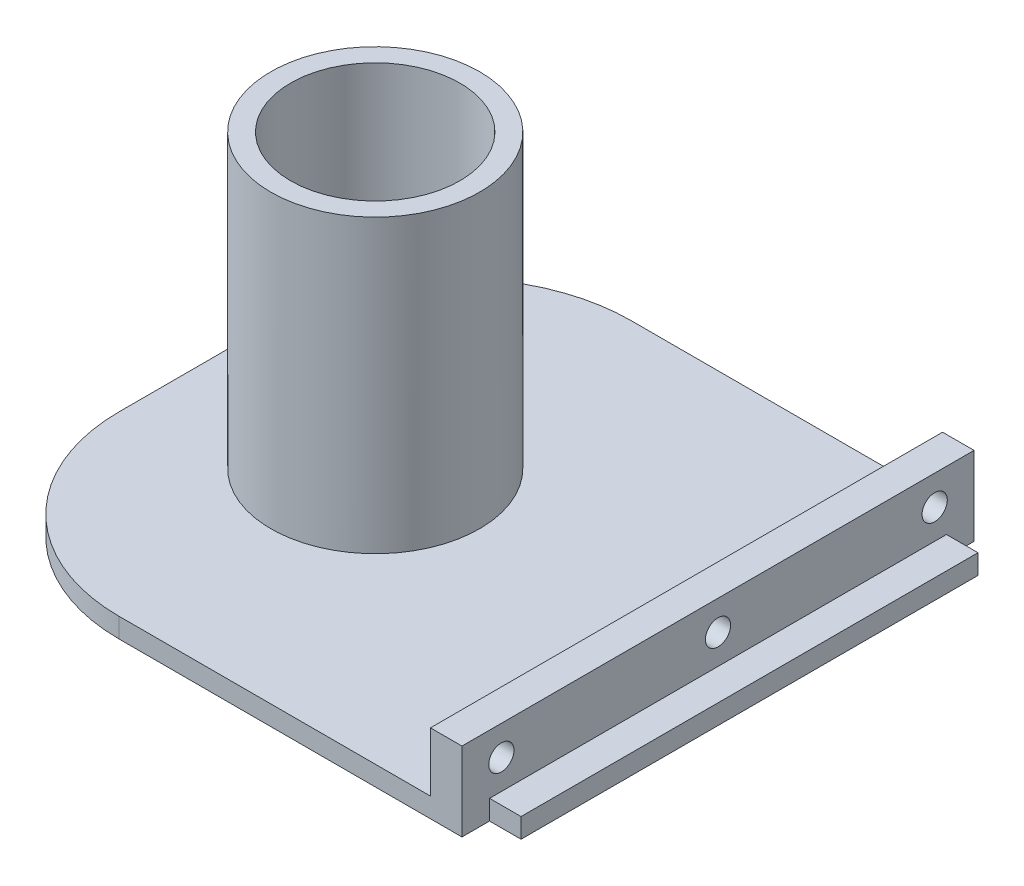
ISO-10303-21;
HEADER;
FILE_DESCRIPTION(('STEP AP214'),'2;1');
FILE_NAME('part.step','',(''),(''),'','','');
FILE_SCHEMA(('AUTOMOTIVE_DESIGN { 1 0 10303 214 1 1 1 1 }'));
ENDSEC;
DATA;
#1=APPLICATION_CONTEXT('core data for automotive mechanical design processes');
#2=APPLICATION_PROTOCOL_DEFINITION('international standard','automotive_design',2000,#1);
#3=PRODUCT_CONTEXT('',#1,'mechanical');
#4=PRODUCT('Part','Part','',(#3));
#5=PRODUCT_RELATED_PRODUCT_CATEGORY('part','',(#4));
#6=PRODUCT_DEFINITION_FORMATION('','',#4);
#7=PRODUCT_DEFINITION_CONTEXT('part definition',#1,'design');
#8=PRODUCT_DEFINITION('design','',#6,#7);
#9=PRODUCT_DEFINITION_SHAPE('','',#8);
#10=(LENGTH_UNIT() NAMED_UNIT(*) SI_UNIT(.MILLI.,.METRE.));
#11=(NAMED_UNIT(*) PLANE_ANGLE_UNIT() SI_UNIT($,.RADIAN.));
#12=(NAMED_UNIT(*) SI_UNIT($,.STERADIAN.) SOLID_ANGLE_UNIT());
#13=UNCERTAINTY_MEASURE_WITH_UNIT(LENGTH_MEASURE(1.E-05),#10,'distance_accuracy_value','');
#14=(GEOMETRIC_REPRESENTATION_CONTEXT(3) GLOBAL_UNCERTAINTY_ASSIGNED_CONTEXT((#13)) GLOBAL_UNIT_ASSIGNED_CONTEXT((#10,
#11,#12)) REPRESENTATION_CONTEXT('',''));
#15=CARTESIAN_POINT('',(0.,0.,0.));
#16=DIRECTION('',(0.,0.,1.));
#17=DIRECTION('',(1.,0.,0.));
#18=AXIS2_PLACEMENT_3D('',#15,#16,#17);
#19=CARTESIAN_POINT('',(-12.51,1.25,10.01));
#20=DIRECTION('',(0.,-1.,0.));
#21=DIRECTION('',(0.,0.,-1.));
#22=AXIS2_PLACEMENT_3D('',#19,#20,#21);
#23=PLANE('',#22);
#24=CARTESIAN_POINT('',(-12.51,1.25,0.));
#25=DIRECTION('',(0.,-1.,0.));
#26=DIRECTION('',(0.,0.,-1.));
#27=AXIS2_PLACEMENT_3D('',#24,#25,#26);
#28=CIRCLE('',#27,13.25);
#29=CARTESIAN_POINT('',(-12.51,1.25,-13.25));
#30=VERTEX_POINT('',#29);
#31=EDGE_CURVE('E223',#30,#30,#28,.F.);
#32=ORIENTED_EDGE('',*,*,#31,.F.);
#33=EDGE_LOOP('',(#32));
#34=FACE_BOUND('',#33,.T.);
#35=DIRECTION('',(0.,0.,1.));
#36=VECTOR('',#35,1.);
#37=CARTESIAN_POINT('',(27.,1.25,32.5));
#38=LINE('',#37,#36);
#39=CARTESIAN_POINT('',(27.,1.25,-32.5));
#40=VERTEX_POINT('',#39);
#41=CARTESIAN_POINT('',(27.,1.25,32.5));
#42=VERTEX_POINT('',#41);
#43=EDGE_CURVE('E50',#40,#42,#38,.T.);
#44=ORIENTED_EDGE('',*,*,#43,.F.);
#45=DIRECTION('',(-1.,0.,0.));
#46=VECTOR('',#45,1.);
#47=CARTESIAN_POINT('',(-12.51,1.25,-32.5));
#48=LINE('',#47,#46);
#49=CARTESIAN_POINT('',(-12.51,1.25,-32.5));
#50=VERTEX_POINT('',#49);
#51=EDGE_CURVE('E145',#40,#50,#48,.T.);
#52=ORIENTED_EDGE('',*,*,#51,.T.);
#53=CARTESIAN_POINT('',(-12.51,1.25,-10.01));
#54=DIRECTION('',(0.,1.,0.));
#55=DIRECTION('',(0.,0.,-1.));
#56=AXIS2_PLACEMENT_3D('',#53,#54,#55);
#57=CIRCLE('',#56,22.49);
#58=CARTESIAN_POINT('',(-35.,1.25,-10.01));
#59=VERTEX_POINT('',#58);
#60=EDGE_CURVE('E171',#50,#59,#57,.T.);
#61=ORIENTED_EDGE('',*,*,#60,.T.);
#62=DIRECTION('',(0.,0.,1.));
#63=VECTOR('',#62,1.);
#64=CARTESIAN_POINT('',(-35.,1.25,-10.01));
#65=LINE('',#64,#63);
#66=CARTESIAN_POINT('',(-35.,1.25,10.01));
#67=VERTEX_POINT('',#66);
#68=EDGE_CURVE('E173',#59,#67,#65,.T.);
#69=ORIENTED_EDGE('',*,*,#68,.T.);
#70=CARTESIAN_POINT('',(-12.51,1.25,10.01));
#71=DIRECTION('',(0.,1.,0.));
#72=DIRECTION('',(0.,0.,-1.));
#73=AXIS2_PLACEMENT_3D('',#70,#71,#72);
#74=CIRCLE('',#73,22.49);
#75=CARTESIAN_POINT('',(-12.51,1.25,32.5));
#76=VERTEX_POINT('',#75);
#77=EDGE_CURVE('E160',#67,#76,#74,.T.);
#78=ORIENTED_EDGE('',*,*,#77,.T.);
#79=DIRECTION('',(1.,0.,0.));
#80=VECTOR('',#79,1.);
#81=CARTESIAN_POINT('',(-12.51,1.25,32.5));
#82=LINE('',#81,#80);
#83=EDGE_CURVE('E55',#76,#42,#82,.T.);
#84=ORIENTED_EDGE('',*,*,#83,.T.);
#85=EDGE_LOOP('',(#44,#52,#61,#69,#78,#84));
#86=FACE_BOUND('',#85,.T.);
#87=ADVANCED_FACE('F34',(#34,#86),#23,.F.);
#88=DIRECTION('',(0.,0.,-1.));
#89=VECTOR('',#88,1.);
#90=CARTESIAN_POINT('',(31.,1.25,10.01));
#91=LINE('',#90,#89);
#92=CARTESIAN_POINT('',(31.,1.25,29.));
#93=VERTEX_POINT('',#92);
#94=CARTESIAN_POINT('',(31.,1.25,-29.));
#95=VERTEX_POINT('',#94);
#96=EDGE_CURVE('E226',#93,#95,#91,.T.);
#97=ORIENTED_EDGE('',*,*,#96,.F.);
#98=DIRECTION('',(1.,0.,0.));
#99=VECTOR('',#98,1.);
#100=CARTESIAN_POINT('',(31.,1.25,29.));
#101=LINE('',#100,#99);
#102=CARTESIAN_POINT('',(35.,1.25,29.));
#103=VERTEX_POINT('',#102);
#104=EDGE_CURVE('E164',#93,#103,#101,.T.);
#105=ORIENTED_EDGE('',*,*,#104,.T.);
#106=DIRECTION('',(0.,0.,-1.));
#107=VECTOR('',#106,1.);
#108=CARTESIAN_POINT('',(35.,1.25,-29.));
#109=LINE('',#108,#107);
#110=CARTESIAN_POINT('',(35.,1.25,-29.));
#111=VERTEX_POINT('',#110);
#112=EDGE_CURVE('E166',#103,#111,#109,.T.);
#113=ORIENTED_EDGE('',*,*,#112,.T.);
#114=DIRECTION('',(-1.,0.,0.));
#115=VECTOR('',#114,1.);
#116=CARTESIAN_POINT('',(31.,1.25,-29.));
#117=LINE('',#116,#115);
#118=EDGE_CURVE('E168',#111,#95,#117,.T.);
#119=ORIENTED_EDGE('',*,*,#118,.T.);
#120=EDGE_LOOP('',(#97,#105,#113,#119));
#121=FACE_BOUND('',#120,.T.);
#122=ADVANCED_FACE('F261',(#121),#23,.F.);
#123=CARTESIAN_POINT('',(-12.51,1.25,10.01));
#124=DIRECTION('',(0.,-1.,0.));
#125=DIRECTION('',(0.,0.,-1.));
#126=AXIS2_PLACEMENT_3D('',#123,#124,#125);
#127=CYLINDRICAL_SURFACE('',#126,22.49);
#128=CARTESIAN_POINT('',(-12.51,-1.25,10.01));
#129=DIRECTION('',(0.,1.,0.));
#130=DIRECTION('',(0.,0.,-1.));
#131=AXIS2_PLACEMENT_3D('',#128,#129,#130);
#132=CIRCLE('',#131,22.49);
#133=CARTESIAN_POINT('',(-35.,-1.25,10.01));
#134=VERTEX_POINT('',#133);
#135=CARTESIAN_POINT('',(-12.51,-1.25,32.5));
#136=VERTEX_POINT('',#135);
#137=EDGE_CURVE('E159',#134,#136,#132,.T.);
#138=ORIENTED_EDGE('',*,*,#137,.T.);
#139=DIRECTION('',(0.,-1.,0.));
#140=VECTOR('',#139,1.);
#141=CARTESIAN_POINT('',(-12.51,1.25,32.5));
#142=LINE('',#141,#140);
#143=EDGE_CURVE('E220',#76,#136,#142,.T.);
#144=ORIENTED_EDGE('',*,*,#143,.F.);
#145=ORIENTED_EDGE('',*,*,#77,.F.);
#146=DIRECTION('',(0.,-1.,0.));
#147=VECTOR('',#146,1.);
#148=CARTESIAN_POINT('',(-35.,1.25,10.01));
#149=LINE('',#148,#147);
#150=EDGE_CURVE('E175',#67,#134,#149,.T.);
#151=ORIENTED_EDGE('',*,*,#150,.T.);
#152=EDGE_LOOP('',(#138,#144,#145,#151));
#153=FACE_BOUND('',#152,.T.);
#154=ADVANCED_FACE('F268',(#153),#127,.T.);
#155=CARTESIAN_POINT('',(-12.51,1.25,32.5));
#156=DIRECTION('',(0.,0.,-1.));
#157=DIRECTION('',(-1.,0.,0.));
#158=AXIS2_PLACEMENT_3D('',#155,#156,#157);
#159=PLANE('',#158);
#160=DIRECTION('',(1.,0.,0.));
#161=VECTOR('',#160,1.);
#162=CARTESIAN_POINT('',(-12.51,-1.25,32.5));
#163=LINE('',#162,#161);
#164=CARTESIAN_POINT('',(31.,-1.25,32.5));
#165=VERTEX_POINT('',#164);
#166=EDGE_CURVE('E178',#136,#165,#163,.T.);
#167=ORIENTED_EDGE('',*,*,#166,.T.);
#168=DIRECTION('',(0.,-1.,0.));
#169=VECTOR('',#168,1.);
#170=CARTESIAN_POINT('',(31.,1.25,32.5));
#171=LINE('',#170,#169);
#172=CARTESIAN_POINT('',(31.,8.75,32.5));
#173=VERTEX_POINT('',#172);
#174=EDGE_CURVE('E217',#173,#165,#171,.T.);
#175=ORIENTED_EDGE('',*,*,#174,.F.);
#176=DIRECTION('',(1.,0.,0.));
#177=VECTOR('',#176,1.);
#178=CARTESIAN_POINT('',(31.,8.75,32.5));
#179=LINE('',#178,#177);
#180=CARTESIAN_POINT('',(27.,8.75,32.5));
#181=VERTEX_POINT('',#180);
#182=EDGE_CURVE('E132',#181,#173,#179,.T.);
#183=ORIENTED_EDGE('',*,*,#182,.F.);
#184=DIRECTION('',(0.,-1.,0.));
#185=VECTOR('',#184,1.);
#186=CARTESIAN_POINT('',(27.,8.75,32.5));
#187=LINE('',#186,#185);
#188=EDGE_CURVE('E128',#181,#42,#187,.T.);
#189=ORIENTED_EDGE('',*,*,#188,.T.);
#190=ORIENTED_EDGE('',*,*,#83,.F.);
#191=ORIENTED_EDGE('',*,*,#143,.T.);
#192=EDGE_LOOP('',(#167,#175,#183,#189,#190,#191));
#193=FACE_BOUND('',#192,.T.);
#194=ADVANCED_FACE('F334',(#193),#159,.F.);
#195=CARTESIAN_POINT('',(31.,1.25,29.));
#196=DIRECTION('',(0.,0.,-1.));
#197=DIRECTION('',(-1.,0.,0.));
#198=AXIS2_PLACEMENT_3D('',#195,#196,#197);
#199=PLANE('',#198);
#200=DIRECTION('',(1.,0.,0.));
#201=VECTOR('',#200,1.);
#202=CARTESIAN_POINT('',(31.,-1.25,29.));
#203=LINE('',#202,#201);
#204=CARTESIAN_POINT('',(31.,-1.25,29.));
#205=VERTEX_POINT('',#204);
#206=CARTESIAN_POINT('',(35.,-1.25,29.));
#207=VERTEX_POINT('',#206);
#208=EDGE_CURVE('E182',#205,#207,#203,.T.);
#209=ORIENTED_EDGE('',*,*,#208,.T.);
#210=DIRECTION('',(0.,-1.,0.));
#211=VECTOR('',#210,1.);
#212=CARTESIAN_POINT('',(35.,1.25,29.));
#213=LINE('',#212,#211);
#214=EDGE_CURVE('E211',#103,#207,#213,.T.);
#215=ORIENTED_EDGE('',*,*,#214,.F.);
#216=ORIENTED_EDGE('',*,*,#104,.F.);
#217=DIRECTION('',(0.,-1.,0.));
#218=VECTOR('',#217,1.);
#219=CARTESIAN_POINT('',(31.,1.25,29.));
#220=LINE('',#219,#218);
#221=EDGE_CURVE('E214',#93,#205,#220,.T.);
#222=ORIENTED_EDGE('',*,*,#221,.T.);
#223=EDGE_LOOP('',(#209,#215,#216,#222));
#224=FACE_BOUND('',#223,.T.);
#225=ADVANCED_FACE('F330',(#224),#199,.F.);
#226=CARTESIAN_POINT('',(35.,1.25,-29.));
#227=DIRECTION('',(-1.,0.,0.));
#228=DIRECTION('',(0.,0.,1.));
#229=AXIS2_PLACEMENT_3D('',#226,#227,#228);
#230=PLANE('',#229);
#231=DIRECTION('',(0.,0.,-1.));
#232=VECTOR('',#231,1.);
#233=CARTESIAN_POINT('',(35.,-1.25,-29.));
#234=LINE('',#233,#232);
#235=CARTESIAN_POINT('',(35.,-1.25,-29.));
#236=VERTEX_POINT('',#235);
#237=EDGE_CURVE('E184',#207,#236,#234,.T.);
#238=ORIENTED_EDGE('',*,*,#237,.T.);
#239=DIRECTION('',(0.,-1.,0.));
#240=VECTOR('',#239,1.);
#241=CARTESIAN_POINT('',(35.,1.25,-29.));
#242=LINE('',#241,#240);
#243=EDGE_CURVE('E208',#111,#236,#242,.T.);
#244=ORIENTED_EDGE('',*,*,#243,.F.);
#245=ORIENTED_EDGE('',*,*,#112,.F.);
#246=ORIENTED_EDGE('',*,*,#214,.T.);
#247=EDGE_LOOP('',(#238,#244,#245,#246));
#248=FACE_BOUND('',#247,.T.);
#249=ADVANCED_FACE('F326',(#248),#230,.F.);
#250=CARTESIAN_POINT('',(31.,1.25,-29.));
#251=DIRECTION('',(0.,0.,1.));
#252=DIRECTION('',(1.,0.,0.));
#253=AXIS2_PLACEMENT_3D('',#250,#251,#252);
#254=PLANE('',#253);
#255=DIRECTION('',(-1.,0.,0.));
#256=VECTOR('',#255,1.);
#257=CARTESIAN_POINT('',(31.,-1.25,-29.));
#258=LINE('',#257,#256);
#259=CARTESIAN_POINT('',(31.,-1.25,-29.));
#260=VERTEX_POINT('',#259);
#261=EDGE_CURVE('E186',#236,#260,#258,.T.);
#262=ORIENTED_EDGE('',*,*,#261,.T.);
#263=DIRECTION('',(0.,-1.,0.));
#264=VECTOR('',#263,1.);
#265=CARTESIAN_POINT('',(31.,1.25,-29.));
#266=LINE('',#265,#264);
#267=EDGE_CURVE('E205',#95,#260,#266,.T.);
#268=ORIENTED_EDGE('',*,*,#267,.F.);
#269=ORIENTED_EDGE('',*,*,#118,.F.);
#270=ORIENTED_EDGE('',*,*,#243,.T.);
#271=EDGE_LOOP('',(#262,#268,#269,#270));
#272=FACE_BOUND('',#271,.T.);
#273=ADVANCED_FACE('F322',(#272),#254,.F.);
#274=CARTESIAN_POINT('',(31.,1.25,-32.5));
#275=DIRECTION('',(-1.,0.,0.));
#276=DIRECTION('',(0.,0.,1.));
#277=AXIS2_PLACEMENT_3D('',#274,#275,#276);
#278=PLANE('',#277);
#279=CARTESIAN_POINT('',(31.,5.,-27.5));
#280=DIRECTION('',(-1.,0.,0.));
#281=DIRECTION('',(0.,0.,1.));
#282=AXIS2_PLACEMENT_3D('',#279,#280,#281);
#283=CIRCLE('',#282,1.6);
#284=CARTESIAN_POINT('',(31.,5.,-25.9));
#285=VERTEX_POINT('',#284);
#286=EDGE_CURVE('E374',#285,#285,#283,.T.);
#287=ORIENTED_EDGE('',*,*,#286,.T.);
#288=EDGE_LOOP('',(#287));
#289=FACE_BOUND('',#288,.T.);
#290=CARTESIAN_POINT('',(31.0000000000001,5.,0.));
#291=DIRECTION('',(-1.,0.,0.));
#292=DIRECTION('',(0.,0.,1.));
#293=AXIS2_PLACEMENT_3D('',#290,#291,#292);
#294=CIRCLE('',#293,1.6);
#295=CARTESIAN_POINT('',(31.0000000000001,5.,1.6));
#296=VERTEX_POINT('',#295);
#297=EDGE_CURVE('E376',#296,#296,#294,.T.);
#298=ORIENTED_EDGE('',*,*,#297,.T.);
#299=EDGE_LOOP('',(#298));
#300=FACE_BOUND('',#299,.T.);
#301=CARTESIAN_POINT('',(31.0000000000001,5.,27.5));
#302=DIRECTION('',(-1.,0.,0.));
#303=DIRECTION('',(0.,0.,1.));
#304=AXIS2_PLACEMENT_3D('',#301,#302,#303);
#305=CIRCLE('',#304,1.6);
#306=CARTESIAN_POINT('',(31.0000000000001,5.,29.1));
#307=VERTEX_POINT('',#306);
#308=EDGE_CURVE('E380',#307,#307,#305,.T.);
#309=ORIENTED_EDGE('',*,*,#308,.T.);
#310=EDGE_LOOP('',(#309));
#311=FACE_BOUND('',#310,.T.);
#312=DIRECTION('',(0.,0.,-1.));
#313=VECTOR('',#312,1.);
#314=CARTESIAN_POINT('',(31.,-1.25,-32.5));
#315=LINE('',#314,#313);
#316=CARTESIAN_POINT('',(31.,-1.25,-32.5));
#317=VERTEX_POINT('',#316);
#318=EDGE_CURVE('E188',#260,#317,#315,.T.);
#319=ORIENTED_EDGE('',*,*,#318,.T.);
#320=DIRECTION('',(0.,-1.,0.));
#321=VECTOR('',#320,1.);
#322=CARTESIAN_POINT('',(31.,1.25,-32.5));
#323=LINE('',#322,#321);
#324=CARTESIAN_POINT('',(31.,8.75,-32.5));
#325=VERTEX_POINT('',#324);
#326=EDGE_CURVE('E203',#325,#317,#323,.T.);
#327=ORIENTED_EDGE('',*,*,#326,.F.);
#328=DIRECTION('',(0.,0.,-1.));
#329=VECTOR('',#328,1.);
#330=CARTESIAN_POINT('',(31.,8.75,-32.5));
#331=LINE('',#330,#329);
#332=EDGE_CURVE('E139',#173,#325,#331,.T.);
#333=ORIENTED_EDGE('',*,*,#332,.F.);
#334=ORIENTED_EDGE('',*,*,#174,.T.);
#335=DIRECTION('',(0.,0.,-1.));
#336=VECTOR('',#335,1.);
#337=CARTESIAN_POINT('',(31.,-1.25,32.5));
#338=LINE('',#337,#336);
#339=EDGE_CURVE('E180',#165,#205,#338,.T.);
#340=ORIENTED_EDGE('',*,*,#339,.T.);
#341=ORIENTED_EDGE('',*,*,#221,.F.);
#342=ORIENTED_EDGE('',*,*,#96,.T.);
#343=ORIENTED_EDGE('',*,*,#267,.T.);
#344=EDGE_LOOP('',(#319,#327,#333,#334,#340,#341,#342,#343));
#345=FACE_BOUND('',#344,.T.);
#346=ADVANCED_FACE('F319',(#289,#300,#311,#345),#278,.F.);
#347=CARTESIAN_POINT('',(-12.51,1.25,-32.5));
#348=DIRECTION('',(0.,0.,1.));
#349=DIRECTION('',(1.,0.,0.));
#350=AXIS2_PLACEMENT_3D('',#347,#348,#349);
#351=PLANE('',#350);
#352=DIRECTION('',(-1.,0.,0.));
#353=VECTOR('',#352,1.);
#354=CARTESIAN_POINT('',(-12.51,-1.25,-32.5));
#355=LINE('',#354,#353);
#356=CARTESIAN_POINT('',(-12.51,-1.25,-32.5));
#357=VERTEX_POINT('',#356);
#358=EDGE_CURVE('E190',#317,#357,#355,.T.);
#359=ORIENTED_EDGE('',*,*,#358,.T.);
#360=DIRECTION('',(0.,-1.,0.));
#361=VECTOR('',#360,1.);
#362=CARTESIAN_POINT('',(-12.51,1.25,-32.5));
#363=LINE('',#362,#361);
#364=EDGE_CURVE('E200',#50,#357,#363,.T.);
#365=ORIENTED_EDGE('',*,*,#364,.F.);
#366=ORIENTED_EDGE('',*,*,#51,.F.);
#367=DIRECTION('',(0.,-1.,0.));
#368=VECTOR('',#367,1.);
#369=CARTESIAN_POINT('',(27.,8.75,-32.5));
#370=LINE('',#369,#368);
#371=CARTESIAN_POINT('',(27.,8.75,-32.5));
#372=VERTEX_POINT('',#371);
#373=EDGE_CURVE('E126',#372,#40,#370,.T.);
#374=ORIENTED_EDGE('',*,*,#373,.F.);
#375=DIRECTION('',(-1.,0.,0.));
#376=VECTOR('',#375,1.);
#377=CARTESIAN_POINT('',(27.,8.75,-32.5));
#378=LINE('',#377,#376);
#379=EDGE_CURVE('E133',#325,#372,#378,.T.);
#380=ORIENTED_EDGE('',*,*,#379,.F.);
#381=ORIENTED_EDGE('',*,*,#326,.T.);
#382=EDGE_LOOP('',(#359,#365,#366,#374,#380,#381));
#383=FACE_BOUND('',#382,.T.);
#384=ADVANCED_FACE('F143',(#383),#351,.F.);
#385=CARTESIAN_POINT('',(-12.51,1.25,-10.01));
#386=DIRECTION('',(0.,-1.,0.));
#387=DIRECTION('',(0.,0.,-1.));
#388=AXIS2_PLACEMENT_3D('',#385,#386,#387);
#389=CYLINDRICAL_SURFACE('',#388,22.49);
#390=CARTESIAN_POINT('',(-12.51,-1.25,-10.01));
#391=DIRECTION('',(0.,1.,0.));
#392=DIRECTION('',(0.,0.,-1.));
#393=AXIS2_PLACEMENT_3D('',#390,#391,#392);
#394=CIRCLE('',#393,22.49);
#395=CARTESIAN_POINT('',(-35.,-1.25,-10.01));
#396=VERTEX_POINT('',#395);
#397=EDGE_CURVE('E192',#357,#396,#394,.T.);
#398=ORIENTED_EDGE('',*,*,#397,.T.);
#399=DIRECTION('',(0.,-1.,0.));
#400=VECTOR('',#399,1.);
#401=CARTESIAN_POINT('',(-35.,1.25,-10.01));
#402=LINE('',#401,#400);
#403=EDGE_CURVE('E197',#59,#396,#402,.T.);
#404=ORIENTED_EDGE('',*,*,#403,.F.);
#405=ORIENTED_EDGE('',*,*,#60,.F.);
#406=ORIENTED_EDGE('',*,*,#364,.T.);
#407=EDGE_LOOP('',(#398,#404,#405,#406));
#408=FACE_BOUND('',#407,.T.);
#409=ADVANCED_FACE('F309',(#408),#389,.T.);
#410=CARTESIAN_POINT('',(-35.,1.25,-10.01));
#411=DIRECTION('',(1.,0.,0.));
#412=DIRECTION('',(0.,0.,-1.));
#413=AXIS2_PLACEMENT_3D('',#410,#411,#412);
#414=PLANE('',#413);
#415=DIRECTION('',(0.,0.,1.));
#416=VECTOR('',#415,1.);
#417=CARTESIAN_POINT('',(-35.,-1.25,-10.01));
#418=LINE('',#417,#416);
#419=EDGE_CURVE('E162',#396,#134,#418,.T.);
#420=ORIENTED_EDGE('',*,*,#419,.T.);
#421=ORIENTED_EDGE('',*,*,#150,.F.);
#422=ORIENTED_EDGE('',*,*,#68,.F.);
#423=ORIENTED_EDGE('',*,*,#403,.T.);
#424=EDGE_LOOP('',(#420,#421,#422,#423));
#425=FACE_BOUND('',#424,.T.);
#426=ADVANCED_FACE('F300',(#425),#414,.F.);
#427=CARTESIAN_POINT('',(-12.51,-1.25,10.01));
#428=DIRECTION('',(0.,-1.,0.));
#429=DIRECTION('',(0.,0.,-1.));
#430=AXIS2_PLACEMENT_3D('',#427,#428,#429);
#431=PLANE('',#430);
#432=ORIENTED_EDGE('',*,*,#137,.F.);
#433=ORIENTED_EDGE('',*,*,#419,.F.);
#434=ORIENTED_EDGE('',*,*,#397,.F.);
#435=ORIENTED_EDGE('',*,*,#358,.F.);
#436=ORIENTED_EDGE('',*,*,#318,.F.);
#437=ORIENTED_EDGE('',*,*,#261,.F.);
#438=ORIENTED_EDGE('',*,*,#237,.F.);
#439=ORIENTED_EDGE('',*,*,#208,.F.);
#440=ORIENTED_EDGE('',*,*,#339,.F.);
#441=ORIENTED_EDGE('',*,*,#166,.F.);
#442=EDGE_LOOP('',(#432,#433,#434,#435,#436,#437,#438,#439,#440,#441));
#443=FACE_BOUND('',#442,.T.);
#444=ADVANCED_FACE('F295',(#443),#431,.T.);
#445=CARTESIAN_POINT('',(-12.51,38.25,0.));
#446=DIRECTION('',(0.,1.,0.));
#447=DIRECTION('',(0.,0.,1.));
#448=AXIS2_PLACEMENT_3D('',#445,#446,#447);
#449=PLANE('',#448);
#450=CARTESIAN_POINT('',(-12.51,38.25,0.));
#451=DIRECTION('',(0.,1.,0.));
#452=DIRECTION('',(0.,0.,1.));
#453=AXIS2_PLACEMENT_3D('',#450,#451,#452);
#454=CIRCLE('',#453,13.25);
#455=CARTESIAN_POINT('',(-12.51,38.25,13.25));
#456=VERTEX_POINT('',#455);
#457=EDGE_CURVE('E155',#456,#456,#454,.T.);
#458=ORIENTED_EDGE('',*,*,#457,.T.);
#459=EDGE_LOOP('',(#458));
#460=FACE_BOUND('',#459,.T.);
#461=CARTESIAN_POINT('',(-12.51,38.25,0.));
#462=DIRECTION('',(0.,1.,0.));
#463=DIRECTION('',(0.,0.,1.));
#464=AXIS2_PLACEMENT_3D('',#461,#462,#463);
#465=CIRCLE('',#464,10.75);
#466=CARTESIAN_POINT('',(-12.51,38.25,10.75));
#467=VERTEX_POINT('',#466);
#468=EDGE_CURVE('E149',#467,#467,#465,.T.);
#469=ORIENTED_EDGE('',*,*,#468,.F.);
#470=EDGE_LOOP('',(#469));
#471=FACE_BOUND('',#470,.T.);
#472=ADVANCED_FACE('F290',(#460,#471),#449,.T.);
#473=CARTESIAN_POINT('',(-12.51,38.25,0.));
#474=DIRECTION('',(0.,-1.,0.));
#475=DIRECTION('',(0.,0.,-1.));
#476=AXIS2_PLACEMENT_3D('',#473,#474,#475);
#477=CYLINDRICAL_SURFACE('',#476,13.25);
#478=ORIENTED_EDGE('',*,*,#457,.F.);
#479=EDGE_LOOP('',(#478));
#480=FACE_BOUND('',#479,.T.);
#481=ORIENTED_EDGE('',*,*,#31,.T.);
#482=EDGE_LOOP('',(#481));
#483=FACE_BOUND('',#482,.T.);
#484=ADVANCED_FACE('F282',(#480,#483),#477,.T.);
#485=CARTESIAN_POINT('',(-12.51,38.25,0.));
#486=DIRECTION('',(0.,-1.,0.));
#487=DIRECTION('',(0.,0.,-1.));
#488=AXIS2_PLACEMENT_3D('',#485,#486,#487);
#489=CYLINDRICAL_SURFACE('',#488,10.75);
#490=ORIENTED_EDGE('',*,*,#468,.T.);
#491=EDGE_LOOP('',(#490));
#492=FACE_BOUND('',#491,.T.);
#493=CARTESIAN_POINT('',(-12.51,1.25,0.));
#494=DIRECTION('',(0.,1.,0.));
#495=DIRECTION('',(0.,0.,1.));
#496=AXIS2_PLACEMENT_3D('',#493,#494,#495);
#497=CIRCLE('',#496,10.75);
#498=CARTESIAN_POINT('',(-12.51,1.25,10.75));
#499=VERTEX_POINT('',#498);
#500=EDGE_CURVE('E146',#499,#499,#497,.T.);
#501=ORIENTED_EDGE('',*,*,#500,.F.);
#502=EDGE_LOOP('',(#501));
#503=FACE_BOUND('',#502,.T.);
#504=ADVANCED_FACE('F274',(#492,#503),#489,.F.);
#505=ORIENTED_EDGE('',*,*,#500,.T.);
#506=EDGE_LOOP('',(#505));
#507=FACE_BOUND('',#506,.T.);
#508=ADVANCED_FACE('F264',(#507),#23,.F.);
#509=CARTESIAN_POINT('',(27.,8.75,32.5));
#510=DIRECTION('',(1.,0.,0.));
#511=DIRECTION('',(0.,0.,-1.));
#512=AXIS2_PLACEMENT_3D('',#509,#510,#511);
#513=PLANE('',#512);
#514=CARTESIAN_POINT('',(27.,5.,27.5));
#515=DIRECTION('',(1.,0.,0.));
#516=DIRECTION('',(0.,0.,-1.));
#517=AXIS2_PLACEMENT_3D('',#514,#515,#516);
#518=CIRCLE('',#517,3.09999999999999);
#519=CARTESIAN_POINT('',(27.,5.,24.4));
#520=VERTEX_POINT('',#519);
#521=EDGE_CURVE('E238',#520,#520,#518,.T.);
#522=ORIENTED_EDGE('',*,*,#521,.T.);
#523=EDGE_LOOP('',(#522));
#524=FACE_BOUND('',#523,.T.);
#525=CARTESIAN_POINT('',(27.,5.,0.));
#526=DIRECTION('',(1.,0.,0.));
#527=DIRECTION('',(0.,0.,-1.));
#528=AXIS2_PLACEMENT_3D('',#525,#526,#527);
#529=CIRCLE('',#528,3.10000000000001);
#530=CARTESIAN_POINT('',(27.,5.,-3.10000000000001));
#531=VERTEX_POINT('',#530);
#532=EDGE_CURVE('E235',#531,#531,#529,.T.);
#533=ORIENTED_EDGE('',*,*,#532,.T.);
#534=EDGE_LOOP('',(#533));
#535=FACE_BOUND('',#534,.T.);
#536=CARTESIAN_POINT('',(27.,5.,-27.5));
#537=DIRECTION('',(1.,0.,0.));
#538=DIRECTION('',(0.,0.,-1.));
#539=AXIS2_PLACEMENT_3D('',#536,#537,#538);
#540=CIRCLE('',#539,3.10000000000001);
#541=CARTESIAN_POINT('',(27.,5.,-30.6));
#542=VERTEX_POINT('',#541);
#543=EDGE_CURVE('E232',#542,#542,#540,.T.);
#544=ORIENTED_EDGE('',*,*,#543,.T.);
#545=EDGE_LOOP('',(#544));
#546=FACE_BOUND('',#545,.T.);
#547=ORIENTED_EDGE('',*,*,#43,.T.);
#548=ORIENTED_EDGE('',*,*,#188,.F.);
#549=DIRECTION('',(0.,0.,1.));
#550=VECTOR('',#549,1.);
#551=CARTESIAN_POINT('',(27.,8.75,32.5));
#552=LINE('',#551,#550);
#553=EDGE_CURVE('E122',#372,#181,#552,.T.);
#554=ORIENTED_EDGE('',*,*,#553,.F.);
#555=ORIENTED_EDGE('',*,*,#373,.T.);
#556=EDGE_LOOP('',(#547,#548,#554,#555));
#557=FACE_BOUND('',#556,.T.);
#558=ADVANCED_FACE('F124',(#524,#535,#546,#557),#513,.F.);
#559=CARTESIAN_POINT('',(0.,8.75,0.));
#560=DIRECTION('',(0.,-1.,0.));
#561=DIRECTION('',(0.,0.,-1.));
#562=AXIS2_PLACEMENT_3D('',#559,#560,#561);
#563=PLANE('',#562);
#564=ORIENTED_EDGE('',*,*,#379,.T.);
#565=ORIENTED_EDGE('',*,*,#553,.T.);
#566=ORIENTED_EDGE('',*,*,#182,.T.);
#567=ORIENTED_EDGE('',*,*,#332,.T.);
#568=EDGE_LOOP('',(#564,#565,#566,#567));
#569=FACE_BOUND('',#568,.T.);
#570=ADVANCED_FACE('F137',(#569),#563,.F.);
#571=CARTESIAN_POINT('',(34.5,5.,27.5));
#572=DIRECTION('',(-1.,0.,0.));
#573=DIRECTION('',(0.,0.,1.));
#574=AXIS2_PLACEMENT_3D('',#571,#572,#573);
#575=CYLINDRICAL_SURFACE('',#574,1.6);
#576=CARTESIAN_POINT('',(28.5,5.,27.5));
#577=DIRECTION('',(1.,0.,0.));
#578=DIRECTION('',(0.,0.,-1.));
#579=AXIS2_PLACEMENT_3D('',#576,#577,#578);
#580=CIRCLE('',#579,1.6);
#581=CARTESIAN_POINT('',(28.5,5.,25.9));
#582=VERTEX_POINT('',#581);
#583=EDGE_CURVE('E229',#582,#582,#580,.F.);
#584=ORIENTED_EDGE('',*,*,#583,.T.);
#585=EDGE_LOOP('',(#584));
#586=FACE_BOUND('',#585,.T.);
#587=ORIENTED_EDGE('',*,*,#308,.F.);
#588=EDGE_LOOP('',(#587));
#589=FACE_BOUND('',#588,.T.);
#590=ADVANCED_FACE('F387',(#586,#589),#575,.F.);
#591=CARTESIAN_POINT('',(34.5,5.,0.));
#592=DIRECTION('',(-1.,0.,0.));
#593=DIRECTION('',(0.,0.,1.));
#594=AXIS2_PLACEMENT_3D('',#591,#592,#593);
#595=CYLINDRICAL_SURFACE('',#594,1.6);
#596=CARTESIAN_POINT('',(28.5,5.,0.));
#597=DIRECTION('',(1.,0.,0.));
#598=DIRECTION('',(0.,0.,-1.));
#599=AXIS2_PLACEMENT_3D('',#596,#597,#598);
#600=CIRCLE('',#599,1.6);
#601=CARTESIAN_POINT('',(28.5,5.,-1.6));
#602=VERTEX_POINT('',#601);
#603=EDGE_CURVE('E43',#602,#602,#600,.F.);
#604=ORIENTED_EDGE('',*,*,#603,.T.);
#605=EDGE_LOOP('',(#604));
#606=FACE_BOUND('',#605,.T.);
#607=ORIENTED_EDGE('',*,*,#297,.F.);
#608=EDGE_LOOP('',(#607));
#609=FACE_BOUND('',#608,.T.);
#610=ADVANCED_FACE('F243',(#606,#609),#595,.F.);
#611=CARTESIAN_POINT('',(34.5,5.,-27.5));
#612=DIRECTION('',(-1.,0.,0.));
#613=DIRECTION('',(0.,0.,1.));
#614=AXIS2_PLACEMENT_3D('',#611,#612,#613);
#615=CYLINDRICAL_SURFACE('',#614,1.6);
#616=CARTESIAN_POINT('',(28.5,5.,-27.5));
#617=DIRECTION('',(1.,0.,0.));
#618=DIRECTION('',(0.,0.,-1.));
#619=AXIS2_PLACEMENT_3D('',#616,#617,#618);
#620=CIRCLE('',#619,1.6);
#621=CARTESIAN_POINT('',(28.5,5.,-29.1));
#622=VERTEX_POINT('',#621);
#623=EDGE_CURVE('E11',#622,#622,#620,.F.);
#624=ORIENTED_EDGE('',*,*,#623,.T.);
#625=EDGE_LOOP('',(#624));
#626=FACE_BOUND('',#625,.T.);
#627=ORIENTED_EDGE('',*,*,#286,.F.);
#628=EDGE_LOOP('',(#627));
#629=FACE_BOUND('',#628,.T.);
#630=ADVANCED_FACE('F255',(#626,#629),#615,.F.);
#631=CARTESIAN_POINT('',(28.5,5.,27.5));
#632=DIRECTION('',(-1.,0.,0.));
#633=DIRECTION('',(0.,0.,1.));
#634=AXIS2_PLACEMENT_3D('',#631,#632,#633);
#635=CONICAL_SURFACE('',#634,1.6,0.785398163397447);
#636=ORIENTED_EDGE('',*,*,#521,.F.);
#637=EDGE_LOOP('',(#636));
#638=FACE_BOUND('',#637,.T.);
#639=ORIENTED_EDGE('',*,*,#583,.F.);
#640=EDGE_LOOP('',(#639));
#641=FACE_BOUND('',#640,.T.);
#642=ADVANCED_FACE('F248',(#638,#641),#635,.F.);
#643=CARTESIAN_POINT('',(28.5,5.,0.));
#644=DIRECTION('',(-1.,0.,0.));
#645=DIRECTION('',(0.,0.,1.));
#646=AXIS2_PLACEMENT_3D('',#643,#644,#645);
#647=CONICAL_SURFACE('',#646,1.6,0.78539816339745);
#648=ORIENTED_EDGE('',*,*,#532,.F.);
#649=EDGE_LOOP('',(#648));
#650=FACE_BOUND('',#649,.T.);
#651=ORIENTED_EDGE('',*,*,#603,.F.);
#652=EDGE_LOOP('',(#651));
#653=FACE_BOUND('',#652,.T.);
#654=ADVANCED_FACE('F246',(#650,#653),#647,.F.);
#655=CARTESIAN_POINT('',(28.5,5.,-27.5));
#656=DIRECTION('',(-1.,0.,0.));
#657=DIRECTION('',(0.,0.,1.));
#658=AXIS2_PLACEMENT_3D('',#655,#656,#657);
#659=CONICAL_SURFACE('',#658,1.6,0.78539816339745);
#660=ORIENTED_EDGE('',*,*,#543,.F.);
#661=EDGE_LOOP('',(#660));
#662=FACE_BOUND('',#661,.T.);
#663=ORIENTED_EDGE('',*,*,#623,.F.);
#664=EDGE_LOOP('',(#663));
#665=FACE_BOUND('',#664,.T.);
#666=ADVANCED_FACE('F37',(#662,#665),#659,.F.);
#667=CLOSED_SHELL('',(#87,#122,#154,#194,#225,#249,#273,#346,#384,#409,#426,#444,#472,#484,#504,
#508,#558,#570,#590,#610,#630,#642,#654,#666));
#668=MANIFOLD_SOLID_BREP('B2',#667);
#669=ADVANCED_BREP_SHAPE_REPRESENTATION('',(#18,#668),#14);
#670=SHAPE_DEFINITION_REPRESENTATION(#9,#669);
ENDSEC;
END-ISO-10303-21;
